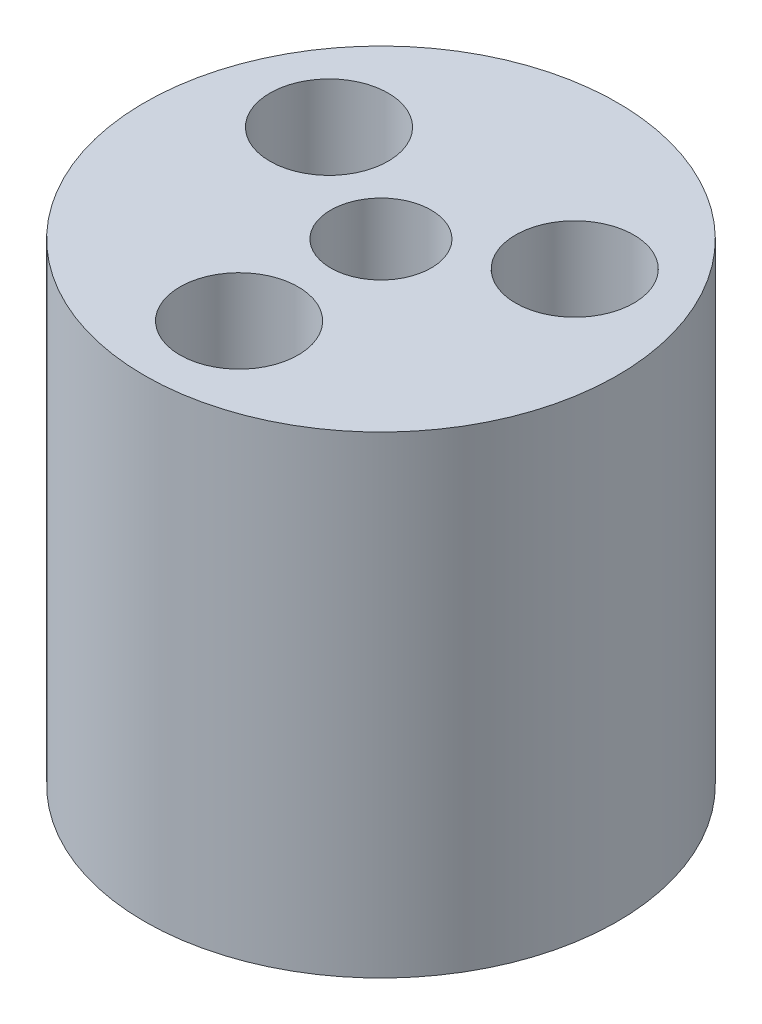
ISO-10303-21;
HEADER;
FILE_DESCRIPTION(('STEP AP214'),'2;1');
FILE_NAME('part.step','',(''),(''),'','','');
FILE_SCHEMA(('AUTOMOTIVE_DESIGN { 1 0 10303 214 1 1 1 1 }'));
ENDSEC;
DATA;
#1=APPLICATION_CONTEXT('core data for automotive mechanical design processes');
#2=APPLICATION_PROTOCOL_DEFINITION('international standard','automotive_design',2000,#1);
#3=PRODUCT_CONTEXT('',#1,'mechanical');
#4=PRODUCT('Part','Part','',(#3));
#5=PRODUCT_RELATED_PRODUCT_CATEGORY('part','',(#4));
#6=PRODUCT_DEFINITION_FORMATION('','',#4);
#7=PRODUCT_DEFINITION_CONTEXT('part definition',#1,'design');
#8=PRODUCT_DEFINITION('design','',#6,#7);
#9=PRODUCT_DEFINITION_SHAPE('','',#8);
#10=(LENGTH_UNIT() NAMED_UNIT(*) SI_UNIT(.MILLI.,.METRE.));
#11=(NAMED_UNIT(*) PLANE_ANGLE_UNIT() SI_UNIT($,.RADIAN.));
#12=(NAMED_UNIT(*) SI_UNIT($,.STERADIAN.) SOLID_ANGLE_UNIT());
#13=UNCERTAINTY_MEASURE_WITH_UNIT(LENGTH_MEASURE(1.E-05),#10,'distance_accuracy_value','');
#14=(GEOMETRIC_REPRESENTATION_CONTEXT(3) GLOBAL_UNCERTAINTY_ASSIGNED_CONTEXT((#13)) GLOBAL_UNIT_ASSIGNED_CONTEXT((#10,
#11,#12)) REPRESENTATION_CONTEXT('',''));
#15=CARTESIAN_POINT('',(0.,0.,0.));
#16=DIRECTION('',(0.,0.,1.));
#17=DIRECTION('',(1.,0.,0.));
#18=AXIS2_PLACEMENT_3D('',#15,#16,#17);
#19=CARTESIAN_POINT('',(0.,20.,0.));
#20=DIRECTION('',(0.,-1.,0.));
#21=DIRECTION('',(0.,0.,-1.));
#22=AXIS2_PLACEMENT_3D('',#19,#20,#21);
#23=CYLINDRICAL_SURFACE('',#22,10.);
#24=CARTESIAN_POINT('',(0.,20.,0.));
#25=DIRECTION('',(0.,1.,0.));
#26=DIRECTION('',(0.,0.,1.));
#27=AXIS2_PLACEMENT_3D('',#24,#25,#26);
#28=CIRCLE('',#27,10.);
#29=CARTESIAN_POINT('',(0.,20.,10.));
#30=VERTEX_POINT('',#29);
#31=EDGE_CURVE('E10',#30,#30,#28,.T.);
#32=ORIENTED_EDGE('',*,*,#31,.F.);
#33=EDGE_LOOP('',(#32));
#34=FACE_BOUND('',#33,.T.);
#35=CARTESIAN_POINT('',(0.,0.,0.));
#36=DIRECTION('',(0.,1.,0.));
#37=DIRECTION('',(0.,0.,1.));
#38=AXIS2_PLACEMENT_3D('',#35,#36,#37);
#39=CIRCLE('',#38,10.);
#40=CARTESIAN_POINT('',(0.,0.,10.));
#41=VERTEX_POINT('',#40);
#42=EDGE_CURVE('E39',#41,#41,#39,.T.);
#43=ORIENTED_EDGE('',*,*,#42,.T.);
#44=EDGE_LOOP('',(#43));
#45=FACE_BOUND('',#44,.T.);
#46=ADVANCED_FACE('F36',(#34,#45),#23,.T.);
#47=CARTESIAN_POINT('',(0.,20.,0.));
#48=DIRECTION('',(0.,1.,0.));
#49=DIRECTION('',(0.,0.,1.));
#50=AXIS2_PLACEMENT_3D('',#47,#48,#49);
#51=PLANE('',#50);
#52=CARTESIAN_POINT('',(0.,20.,0.));
#53=DIRECTION('',(0.,1.,0.));
#54=DIRECTION('',(0.,0.,1.));
#55=AXIS2_PLACEMENT_3D('',#52,#53,#54);
#56=CIRCLE('',#55,2.125);
#57=CARTESIAN_POINT('',(0.,20.,2.125));
#58=VERTEX_POINT('',#57);
#59=EDGE_CURVE('E66',#58,#58,#56,.T.);
#60=ORIENTED_EDGE('',*,*,#59,.F.);
#61=EDGE_LOOP('',(#60));
#62=FACE_BOUND('',#61,.T.);
#63=CARTESIAN_POINT('',(-5.1961524227067,20.,-2.99999999999989));
#64=DIRECTION('',(0.,1.,0.));
#65=DIRECTION('',(0.,0.,1.));
#66=AXIS2_PLACEMENT_3D('',#63,#64,#65);
#67=CIRCLE('',#66,2.50000000000007);
#68=CARTESIAN_POINT('',(-5.1961524227067,20.,-0.499999999999822));
#69=VERTEX_POINT('',#68);
#70=EDGE_CURVE('E61',#69,#69,#67,.T.);
#71=ORIENTED_EDGE('',*,*,#70,.F.);
#72=EDGE_LOOP('',(#71));
#73=FACE_BOUND('',#72,.T.);
#74=CARTESIAN_POINT('',(0.,20.,6.));
#75=DIRECTION('',(0.,1.,0.));
#76=DIRECTION('',(0.,0.,1.));
#77=AXIS2_PLACEMENT_3D('',#74,#75,#76);
#78=CIRCLE('',#77,2.5);
#79=CARTESIAN_POINT('',(0.,20.,8.5));
#80=VERTEX_POINT('',#79);
#81=EDGE_CURVE('E55',#80,#80,#78,.T.);
#82=ORIENTED_EDGE('',*,*,#81,.F.);
#83=EDGE_LOOP('',(#82));
#84=FACE_BOUND('',#83,.T.);
#85=CARTESIAN_POINT('',(5.19615242270658,20.,-3.00000000000008));
#86=DIRECTION('',(0.,1.,0.));
#87=DIRECTION('',(0.,0.,1.));
#88=AXIS2_PLACEMENT_3D('',#85,#86,#87);
#89=CIRCLE('',#88,2.50000000000001);
#90=CARTESIAN_POINT('',(5.19615242270658,20.,-0.500000000000071));
#91=VERTEX_POINT('',#90);
#92=EDGE_CURVE('E48',#91,#91,#89,.T.);
#93=ORIENTED_EDGE('',*,*,#92,.F.);
#94=EDGE_LOOP('',(#93));
#95=FACE_BOUND('',#94,.T.);
#96=ORIENTED_EDGE('',*,*,#31,.T.);
#97=EDGE_LOOP('',(#96));
#98=FACE_BOUND('',#97,.T.);
#99=ADVANCED_FACE('F82',(#62,#73,#84,#95,#98),#51,.T.);
#100=CARTESIAN_POINT('',(0.,0.,0.));
#101=DIRECTION('',(0.,1.,0.));
#102=DIRECTION('',(0.,0.,1.));
#103=AXIS2_PLACEMENT_3D('',#100,#101,#102);
#104=PLANE('',#103);
#105=CARTESIAN_POINT('',(0.,0.,0.));
#106=DIRECTION('',(0.,1.,0.));
#107=DIRECTION('',(0.,0.,1.));
#108=AXIS2_PLACEMENT_3D('',#105,#106,#107);
#109=CIRCLE('',#108,2.125);
#110=CARTESIAN_POINT('',(0.,0.,2.125));
#111=VERTEX_POINT('',#110);
#112=EDGE_CURVE('E52',#111,#111,#109,.T.);
#113=ORIENTED_EDGE('',*,*,#112,.T.);
#114=EDGE_LOOP('',(#113));
#115=FACE_BOUND('',#114,.T.);
#116=ORIENTED_EDGE('',*,*,#42,.F.);
#117=EDGE_LOOP('',(#116));
#118=FACE_BOUND('',#117,.T.);
#119=ADVANCED_FACE('F72',(#115,#118),#104,.F.);
#120=CARTESIAN_POINT('',(5.19615242270658,10.,-3.00000000000008));
#121=DIRECTION('',(0.,1.,0.));
#122=DIRECTION('',(0.,0.,1.));
#123=AXIS2_PLACEMENT_3D('',#120,#121,#122);
#124=CYLINDRICAL_SURFACE('',#123,2.50000000000001);
#125=CARTESIAN_POINT('',(5.19615242270658,10.,-3.00000000000008));
#126=DIRECTION('',(0.,1.,0.));
#127=DIRECTION('',(0.,0.,1.));
#128=AXIS2_PLACEMENT_3D('',#125,#126,#127);
#129=CIRCLE('',#128,2.50000000000001);
#130=CARTESIAN_POINT('',(5.19615242270658,10.,-0.500000000000071));
#131=VERTEX_POINT('',#130);
#132=EDGE_CURVE('E51',#131,#131,#129,.T.);
#133=ORIENTED_EDGE('',*,*,#132,.F.);
#134=EDGE_LOOP('',(#133));
#135=FACE_BOUND('',#134,.T.);
#136=ORIENTED_EDGE('',*,*,#92,.T.);
#137=EDGE_LOOP('',(#136));
#138=FACE_BOUND('',#137,.T.);
#139=ADVANCED_FACE('F92',(#135,#138),#124,.F.);
#140=CARTESIAN_POINT('',(0.,10.,0.));
#141=DIRECTION('',(0.,1.,0.));
#142=DIRECTION('',(0.,0.,1.));
#143=AXIS2_PLACEMENT_3D('',#140,#141,#142);
#144=PLANE('',#143);
#145=ORIENTED_EDGE('',*,*,#132,.T.);
#146=EDGE_LOOP('',(#145));
#147=FACE_BOUND('',#146,.T.);
#148=ADVANCED_FACE('F94',(#147),#144,.T.);
#149=CARTESIAN_POINT('',(0.,10.,6.));
#150=DIRECTION('',(0.,1.,0.));
#151=DIRECTION('',(0.,0.,1.));
#152=AXIS2_PLACEMENT_3D('',#149,#150,#151);
#153=CYLINDRICAL_SURFACE('',#152,2.5);
#154=CARTESIAN_POINT('',(0.,10.,6.));
#155=DIRECTION('',(0.,1.,0.));
#156=DIRECTION('',(0.,0.,1.));
#157=AXIS2_PLACEMENT_3D('',#154,#155,#156);
#158=CIRCLE('',#157,2.5);
#159=CARTESIAN_POINT('',(0.,10.,8.5));
#160=VERTEX_POINT('',#159);
#161=EDGE_CURVE('E58',#160,#160,#158,.T.);
#162=ORIENTED_EDGE('',*,*,#161,.F.);
#163=EDGE_LOOP('',(#162));
#164=FACE_BOUND('',#163,.T.);
#165=ORIENTED_EDGE('',*,*,#81,.T.);
#166=EDGE_LOOP('',(#165));
#167=FACE_BOUND('',#166,.T.);
#168=ADVANCED_FACE('F101',(#164,#167),#153,.F.);
#169=CARTESIAN_POINT('',(0.,10.,0.));
#170=DIRECTION('',(0.,1.,0.));
#171=DIRECTION('',(0.,0.,1.));
#172=AXIS2_PLACEMENT_3D('',#169,#170,#171);
#173=PLANE('',#172);
#174=ORIENTED_EDGE('',*,*,#161,.T.);
#175=EDGE_LOOP('',(#174));
#176=FACE_BOUND('',#175,.T.);
#177=ADVANCED_FACE('F145',(#176),#173,.T.);
#178=CARTESIAN_POINT('',(-5.1961524227067,10.,-2.99999999999989));
#179=DIRECTION('',(0.,1.,0.));
#180=DIRECTION('',(0.,0.,1.));
#181=AXIS2_PLACEMENT_3D('',#178,#179,#180);
#182=CYLINDRICAL_SURFACE('',#181,2.50000000000007);
#183=CARTESIAN_POINT('',(-5.1961524227067,10.,-2.99999999999989));
#184=DIRECTION('',(0.,1.,0.));
#185=DIRECTION('',(0.,0.,1.));
#186=AXIS2_PLACEMENT_3D('',#183,#184,#185);
#187=CIRCLE('',#186,2.50000000000007);
#188=CARTESIAN_POINT('',(-5.1961524227067,10.,-0.499999999999822));
#189=VERTEX_POINT('',#188);
#190=EDGE_CURVE('E46',#189,#189,#187,.T.);
#191=ORIENTED_EDGE('',*,*,#190,.F.);
#192=EDGE_LOOP('',(#191));
#193=FACE_BOUND('',#192,.T.);
#194=ORIENTED_EDGE('',*,*,#70,.T.);
#195=EDGE_LOOP('',(#194));
#196=FACE_BOUND('',#195,.T.);
#197=ADVANCED_FACE('F138',(#193,#196),#182,.F.);
#198=CARTESIAN_POINT('',(0.,10.,0.));
#199=DIRECTION('',(0.,1.,0.));
#200=DIRECTION('',(0.,0.,1.));
#201=AXIS2_PLACEMENT_3D('',#198,#199,#200);
#202=PLANE('',#201);
#203=ORIENTED_EDGE('',*,*,#190,.T.);
#204=EDGE_LOOP('',(#203));
#205=FACE_BOUND('',#204,.T.);
#206=ADVANCED_FACE('F78',(#205),#202,.T.);
#207=CARTESIAN_POINT('',(0.,0.,0.));
#208=DIRECTION('',(0.,1.,0.));
#209=DIRECTION('',(0.,0.,1.));
#210=AXIS2_PLACEMENT_3D('',#207,#208,#209);
#211=CYLINDRICAL_SURFACE('',#210,2.125);
#212=ORIENTED_EDGE('',*,*,#112,.F.);
#213=EDGE_LOOP('',(#212));
#214=FACE_BOUND('',#213,.T.);
#215=ORIENTED_EDGE('',*,*,#59,.T.);
#216=EDGE_LOOP('',(#215));
#217=FACE_BOUND('',#216,.T.);
#218=ADVANCED_FACE('F75',(#214,#217),#211,.F.);
#219=CLOSED_SHELL('',(#46,#99,#119,#139,#148,#168,#177,#197,#206,#218));
#220=MANIFOLD_SOLID_BREP('B2',#219);
#221=ADVANCED_BREP_SHAPE_REPRESENTATION('',(#18,#220),#14);
#222=SHAPE_DEFINITION_REPRESENTATION(#9,#221);
ENDSEC;
END-ISO-10303-21;
